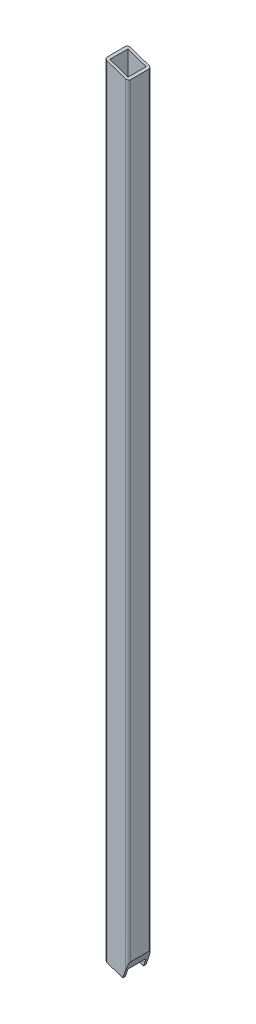
ISO-10303-21;
HEADER;
FILE_DESCRIPTION(('STEP AP214'),'2;1');
FILE_NAME('part.step','',(''),(''),'','','');
FILE_SCHEMA(('AUTOMOTIVE_DESIGN { 1 0 10303 214 1 1 1 1 }'));
ENDSEC;
DATA;
#1=APPLICATION_CONTEXT('core data for automotive mechanical design processes');
#2=APPLICATION_PROTOCOL_DEFINITION('international standard','automotive_design',2000,#1);
#3=PRODUCT_CONTEXT('',#1,'mechanical');
#4=PRODUCT('Part','Part','',(#3));
#5=PRODUCT_RELATED_PRODUCT_CATEGORY('part','',(#4));
#6=PRODUCT_DEFINITION_FORMATION('','',#4);
#7=PRODUCT_DEFINITION_CONTEXT('part definition',#1,'design');
#8=PRODUCT_DEFINITION('design','',#6,#7);
#9=PRODUCT_DEFINITION_SHAPE('','',#8);
#10=(LENGTH_UNIT() NAMED_UNIT(*) SI_UNIT(.MILLI.,.METRE.));
#11=(NAMED_UNIT(*) PLANE_ANGLE_UNIT() SI_UNIT($,.RADIAN.));
#12=(NAMED_UNIT(*) SI_UNIT($,.STERADIAN.) SOLID_ANGLE_UNIT());
#13=UNCERTAINTY_MEASURE_WITH_UNIT(LENGTH_MEASURE(1.E-05),#10,'distance_accuracy_value','');
#14=(GEOMETRIC_REPRESENTATION_CONTEXT(3) GLOBAL_UNCERTAINTY_ASSIGNED_CONTEXT((#13)) GLOBAL_UNIT_ASSIGNED_CONTEXT((#10,
#11,#12)) REPRESENTATION_CONTEXT('',''));
#15=CARTESIAN_POINT('',(0.,0.,0.));
#16=DIRECTION('',(0.,0.,1.));
#17=DIRECTION('',(1.,0.,0.));
#18=AXIS2_PLACEMENT_3D('',#15,#16,#17);
#19=CARTESIAN_POINT('',(25.6,870.,2.80000000000002));
#20=DIRECTION('',(-1.,0.,0.));
#21=DIRECTION('',(0.,0.,1.));
#22=AXIS2_PLACEMENT_3D('',#19,#20,#21);
#23=PLANE('',#22);
#24=DIRECTION('',(0.,0.,1.));
#25=VECTOR('',#24,1.);
#26=CARTESIAN_POINT('',(25.6,22.1138640695995,2.80000000000312));
#27=LINE('',#26,#25);
#28=CARTESIAN_POINT('',(25.6,22.1138640695993,2.80000000000002));
#29=VERTEX_POINT('',#28);
#30=CARTESIAN_POINT('',(25.6,22.1138640695995,22.8));
#31=VERTEX_POINT('',#30);
#32=EDGE_CURVE('E180',#29,#31,#27,.T.);
#33=ORIENTED_EDGE('',*,*,#32,.F.);
#34=DIRECTION('',(0.,-1.,0.));
#35=VECTOR('',#34,1.);
#36=CARTESIAN_POINT('',(25.6,870.,2.80000000000002));
#37=LINE('',#36,#35);
#38=CARTESIAN_POINT('',(25.6,861.185213099785,2.80000000000002));
#39=VERTEX_POINT('',#38);
#40=EDGE_CURVE('E220',#39,#29,#37,.T.);
#41=ORIENTED_EDGE('',*,*,#40,.F.);
#42=DIRECTION('',(0.,0.,1.));
#43=VECTOR('',#42,1.);
#44=CARTESIAN_POINT('',(25.6000000000001,861.185213099785,-1094.14120190298));
#45=LINE('',#44,#43);
#46=CARTESIAN_POINT('',(25.6,861.185213099785,22.8));
#47=VERTEX_POINT('',#46);
#48=EDGE_CURVE('E188',#39,#47,#45,.T.);
#49=ORIENTED_EDGE('',*,*,#48,.T.);
#50=DIRECTION('',(0.,-1.,0.));
#51=VECTOR('',#50,1.);
#52=CARTESIAN_POINT('',(25.6,870.,22.8));
#53=LINE('',#52,#51);
#54=EDGE_CURVE('E190',#47,#31,#53,.T.);
#55=ORIENTED_EDGE('',*,*,#54,.T.);
#56=EDGE_LOOP('',(#33,#41,#49,#55));
#57=FACE_BOUND('',#56,.T.);
#58=ADVANCED_FACE('F38',(#57),#23,.F.);
#59=CARTESIAN_POINT('',(22.8,1040.5,2.8));
#60=DIRECTION('',(1.,0.,0.));
#61=DIRECTION('',(0.,0.,-1.));
#62=AXIS2_PLACEMENT_3D('',#59,#60,#61);
#63=PLANE('',#62);
#64=DIRECTION('',(0.,-1.,0.));
#65=VECTOR('',#64,1.);
#66=CARTESIAN_POINT('',(22.8,1040.5,2.8));
#67=LINE('',#66,#65);
#68=CARTESIAN_POINT('',(22.8,862.149330416996,2.8));
#69=VERTEX_POINT('',#68);
#70=CARTESIAN_POINT('',(22.8,13.9820736121069,2.8));
#71=VERTEX_POINT('',#70);
#72=EDGE_CURVE('E171',#69,#71,#67,.T.);
#73=ORIENTED_EDGE('',*,*,#72,.T.);
#74=DIRECTION('',(0.,0.,-1.));
#75=VECTOR('',#74,1.);
#76=CARTESIAN_POINT('',(22.8,13.982073612107,2.8000000000022));
#77=LINE('',#76,#75);
#78=CARTESIAN_POINT('',(22.8,13.982073612107,22.8));
#79=VERTEX_POINT('',#78);
#80=EDGE_CURVE('E12',#79,#71,#77,.T.);
#81=ORIENTED_EDGE('',*,*,#80,.F.);
#82=DIRECTION('',(0.,-1.,0.));
#83=VECTOR('',#82,1.);
#84=CARTESIAN_POINT('',(22.8,1040.5,22.8));
#85=LINE('',#84,#83);
#86=CARTESIAN_POINT('',(22.8,862.149330416996,22.8));
#87=VERTEX_POINT('',#86);
#88=EDGE_CURVE('E193',#87,#79,#85,.T.);
#89=ORIENTED_EDGE('',*,*,#88,.F.);
#90=DIRECTION('',(0.,0.,-1.));
#91=VECTOR('',#90,1.);
#92=CARTESIAN_POINT('',(22.8,862.149330416996,2.80000000000001));
#93=LINE('',#92,#91);
#94=EDGE_CURVE('E192',#87,#69,#93,.T.);
#95=ORIENTED_EDGE('',*,*,#94,.T.);
#96=EDGE_LOOP('',(#73,#81,#89,#95));
#97=FACE_BOUND('',#96,.T.);
#98=ADVANCED_FACE('F288',(#97),#63,.F.);
#99=CARTESIAN_POINT('',(-350.658923348841,132.997777714205,-118.26127627002));
#100=DIRECTION('',(-0.325568118212889,-0.945518470338344,-0.000471860526607836));
#101=DIRECTION('',(-0.292327412285095,0.100181775938393,0.951056410417663));
#102=AXIS2_PLACEMENT_3D('',#99,#100,#101);
#103=PLANE('',#102);
#104=DIRECTION('',(-0.945518575599321,0.325568154457146,0.));
#105=VECTOR('',#104,1.);
#106=CARTESIAN_POINT('',(-261.554850767002,102.257766836075,0.));
#107=LINE('',#106,#105);
#108=CARTESIAN_POINT('',(19.833886501648,5.36785452577174,0.));
#109=VERTEX_POINT('',#108);
#110=CARTESIAN_POINT('',(2.80000000000002,11.2330920099309,0.));
#111=VERTEX_POINT('',#110);
#112=EDGE_CURVE('E176',#109,#111,#107,.T.);
#113=ORIENTED_EDGE('',*,*,#112,.F.);
#114=DIRECTION('',(-0.000153622760809861,-0.000446152892999452,0.999999888673816));
#115=VECTOR('',#114,1.);
#116=CARTESIAN_POINT('',(19.8520541274279,5.42061714218314,-118.26127627002));
#117=LINE('',#116,#115);
#118=CARTESIAN_POINT('',(19.8334563578698,5.36660529753204,2.8));
#119=VERTEX_POINT('',#118);
#120=EDGE_CURVE('E61',#109,#119,#117,.T.);
#121=ORIENTED_EDGE('',*,*,#120,.T.);
#122=DIRECTION('',(0.945518575599321,-0.325568154457146,0.));
#123=VECTOR('',#122,1.);
#124=CARTESIAN_POINT('',(-314.040421682291,120.328600862861,2.79999999999995));
#125=LINE('',#124,#123);
#126=CARTESIAN_POINT('',(2.8,11.2316946713109,2.8));
#127=VERTEX_POINT('',#126);
#128=EDGE_CURVE('E172',#127,#119,#125,.T.);
#129=ORIENTED_EDGE('',*,*,#128,.F.);
#130=DIRECTION('',(0.,-0.000499049444989014,0.999999875474818));
#131=VECTOR('',#130,1.);
#132=CARTESIAN_POINT('',(2.8,11.2319510109411,2.28634428744401));
#133=LINE('',#132,#131);
#134=CARTESIAN_POINT('',(2.80000000000002,11.2217136811683,22.8));
#135=VERTEX_POINT('',#134);
#136=EDGE_CURVE('E169',#127,#135,#133,.T.);
#137=ORIENTED_EDGE('',*,*,#136,.T.);
#138=DIRECTION('',(0.945518575599319,-0.325568154457149,0.));
#139=VECTOR('',#138,1.);
#140=CARTESIAN_POINT('',(-314.043494137852,120.31967780401,22.7999999999999));
#141=LINE('',#140,#139);
#142=CARTESIAN_POINT('',(19.8303839023116,5.35768223867875,22.8));
#143=VERTEX_POINT('',#142);
#144=EDGE_CURVE('E156',#135,#143,#141,.T.);
#145=ORIENTED_EDGE('',*,*,#144,.T.);
#146=DIRECTION('',(-0.000153622760809861,-0.000446152892999452,0.999999888673816));
#147=VECTOR('',#146,1.);
#148=CARTESIAN_POINT('',(19.852054127428,5.42061714218309,-118.26127627002));
#149=LINE('',#148,#147);
#150=CARTESIAN_POINT('',(19.8299537585333,5.35643301043922,25.6));
#151=VERTEX_POINT('',#150);
#152=EDGE_CURVE('E143',#143,#151,#149,.T.);
#153=ORIENTED_EDGE('',*,*,#152,.T.);
#154=DIRECTION('',(-0.945518575599319,0.325568154457149,0.));
#155=VECTOR('',#154,1.);
#156=CARTESIAN_POINT('',(-261.558783510119,102.246345320745,25.6));
#157=LINE('',#156,#155);
#158=CARTESIAN_POINT('',(2.79999999999999,11.2203163425484,25.6));
#159=VERTEX_POINT('',#158);
#160=EDGE_CURVE('E42',#151,#159,#157,.T.);
#161=ORIENTED_EDGE('',*,*,#160,.T.);
#162=CARTESIAN_POINT('',(2.8,11.2217136811682,22.8));
#163=DIRECTION('',(-0.325568118212889,-0.945518470338344,-0.000471860526607836));
#164=DIRECTION('',(0.94551747726141,-0.325568460157059,0.00137038103480926));
#165=AXIS2_PLACEMENT_3D('',#162,#163,#164);
#166=ELLIPSE('',#165,2.96133823699716,2.8);
#167=CARTESIAN_POINT('',(0.,12.1858309983792,22.8));
#168=VERTEX_POINT('',#167);
#169=EDGE_CURVE('E161',#159,#168,#166,.T.);
#170=ORIENTED_EDGE('',*,*,#169,.T.);
#171=DIRECTION('',(0.,0.000499049444989126,-0.999999875474818));
#172=VECTOR('',#171,1.);
#173=CARTESIAN_POINT('',(0.,12.1960256249539,2.37191334937112));
#174=LINE('',#173,#172);
#175=CARTESIAN_POINT('',(0.,12.1958119885219,2.80000000000002));
#176=VERTEX_POINT('',#175);
#177=EDGE_CURVE('E162',#168,#176,#174,.T.);
#178=ORIENTED_EDGE('',*,*,#177,.T.);
#179=CARTESIAN_POINT('',(2.8,11.2316946713109,2.8));
#180=DIRECTION('',(-0.325568118212889,-0.945518470338344,-0.000471860526607836));
#181=DIRECTION('',(0.94551747726141,-0.325568460157059,0.00137038103480926));
#182=AXIS2_PLACEMENT_3D('',#179,#180,#181);
#183=ELLIPSE('',#182,2.96133823699716,2.8);
#184=EDGE_CURVE('E165',#176,#111,#183,.T.);
#185=ORIENTED_EDGE('',*,*,#184,.T.);
#186=EDGE_LOOP('',(#113,#121,#129,#137,#145,#153,#161,#170,#178,#185));
#187=FACE_BOUND('',#186,.T.);
#188=ADVANCED_FACE('F153',(#187),#103,.T.);
#189=CARTESIAN_POINT('',(2.8,1040.5,2.8));
#190=DIRECTION('',(0.,0.,-1.));
#191=DIRECTION('',(-1.,0.,0.));
#192=AXIS2_PLACEMENT_3D('',#189,#190,#191);
#193=PLANE('',#192);
#194=DIRECTION('',(-0.325568154457149,-0.945518575599319,0.));
#195=VECTOR('',#194,1.);
#196=CARTESIAN_POINT('',(336.673878040164,925.538004434668,2.80000000000005));
#197=LINE('',#196,#195);
#198=EDGE_CURVE('E307',#71,#119,#197,.T.);
#199=ORIENTED_EDGE('',*,*,#198,.F.);
#200=ORIENTED_EDGE('',*,*,#72,.F.);
#201=DIRECTION('',(-0.945518575599319,0.32556815445715,0.));
#202=VECTOR('',#201,1.);
#203=CARTESIAN_POINT('',(-49.9819257164619,887.21015718957,2.79999999999999));
#204=LINE('',#203,#202);
#205=CARTESIAN_POINT('',(2.8,869.035882682789,2.8));
#206=VERTEX_POINT('',#205);
#207=EDGE_CURVE('E174',#69,#206,#204,.T.);
#208=ORIENTED_EDGE('',*,*,#207,.T.);
#209=DIRECTION('',(0.,-1.,0.));
#210=VECTOR('',#209,1.);
#211=CARTESIAN_POINT('',(2.8,1040.5,2.8));
#212=LINE('',#211,#210);
#213=EDGE_CURVE('E175',#206,#127,#212,.T.);
#214=ORIENTED_EDGE('',*,*,#213,.T.);
#215=ORIENTED_EDGE('',*,*,#128,.T.);
#216=EDGE_LOOP('',(#199,#200,#208,#214,#215));
#217=FACE_BOUND('',#216,.T.);
#218=ADVANCED_FACE('F305',(#217),#193,.F.);
#219=CARTESIAN_POINT('',(22.8,870.,2.8));
#220=DIRECTION('',(0.,-1.,0.));
#221=DIRECTION('',(0.,0.,-1.));
#222=AXIS2_PLACEMENT_3D('',#219,#220,#221);
#223=CYLINDRICAL_SURFACE('',#222,2.8);
#224=CARTESIAN_POINT('',(22.8,13.9820736121068,2.8));
#225=DIRECTION('',(0.945518575599319,-0.325568154457149,0.));
#226=DIRECTION('',(-0.325568154457149,-0.945518575599319,0.));
#227=AXIS2_PLACEMENT_3D('',#224,#225,#226);
#228=ELLIPSE('',#227,8.60034976292047,2.8);
#229=CARTESIAN_POINT('',(22.8,13.9820736121067,0.));
#230=VERTEX_POINT('',#229);
#231=EDGE_CURVE('E268',#230,#29,#228,.T.);
#232=ORIENTED_EDGE('',*,*,#231,.F.);
#233=DIRECTION('',(0.,-1.,0.));
#234=VECTOR('',#233,1.);
#235=CARTESIAN_POINT('',(22.8,870.,0.));
#236=LINE('',#235,#234);
#237=CARTESIAN_POINT('',(22.8,862.149330416996,0.));
#238=VERTEX_POINT('',#237);
#239=EDGE_CURVE('E179',#238,#230,#236,.T.);
#240=ORIENTED_EDGE('',*,*,#239,.F.);
#241=CARTESIAN_POINT('',(22.8,862.149330416996,2.8));
#242=DIRECTION('',(-0.32556815445715,-0.945518575599319,0.));
#243=DIRECTION('',(0.945518575599319,-0.32556815445715,0.));
#244=AXIS2_PLACEMENT_3D('',#241,#242,#243);
#245=ELLIPSE('',#244,2.96133790732267,2.8);
#246=EDGE_CURVE('E208',#238,#39,#245,.T.);
#247=ORIENTED_EDGE('',*,*,#246,.T.);
#248=ORIENTED_EDGE('',*,*,#40,.T.);
#249=EDGE_LOOP('',(#232,#240,#247,#248));
#250=FACE_BOUND('',#249,.T.);
#251=ADVANCED_FACE('F263',(#250),#223,.T.);
#252=CARTESIAN_POINT('',(2.80000000000002,870.,0.));
#253=DIRECTION('',(0.,0.,1.));
#254=DIRECTION('',(1.,0.,0.));
#255=AXIS2_PLACEMENT_3D('',#252,#253,#254);
#256=PLANE('',#255);
#257=DIRECTION('',(0.325568154457149,0.945518575599319,0.));
#258=VECTOR('',#257,1.);
#259=CARTESIAN_POINT('',(284.188737268653,773.110087689695,0.));
#260=LINE('',#259,#258);
#261=EDGE_CURVE('E238',#109,#230,#260,.T.);
#262=ORIENTED_EDGE('',*,*,#261,.F.);
#263=ORIENTED_EDGE('',*,*,#112,.T.);
#264=DIRECTION('',(0.,-1.,0.));
#265=VECTOR('',#264,1.);
#266=CARTESIAN_POINT('',(2.80000000000002,870.,0.));
#267=LINE('',#266,#265);
#268=CARTESIAN_POINT('',(2.80000000000002,869.035882682789,0.));
#269=VERTEX_POINT('',#268);
#270=EDGE_CURVE('E209',#269,#111,#267,.T.);
#271=ORIENTED_EDGE('',*,*,#270,.F.);
#272=DIRECTION('',(0.945518575599319,-0.32556815445715,0.));
#273=VECTOR('',#272,1.);
#274=CARTESIAN_POINT('',(2.50321505504944,869.138073934544,0.));
#275=LINE('',#274,#273);
#276=EDGE_CURVE('E178',#269,#238,#275,.T.);
#277=ORIENTED_EDGE('',*,*,#276,.T.);
#278=ORIENTED_EDGE('',*,*,#239,.T.);
#279=EDGE_LOOP('',(#262,#263,#271,#277,#278));
#280=FACE_BOUND('',#279,.T.);
#281=ADVANCED_FACE('F254',(#280),#256,.F.);
#282=CARTESIAN_POINT('',(2.80000000000002,870.,25.6));
#283=DIRECTION('',(0.,0.,-1.));
#284=DIRECTION('',(-1.,0.,0.));
#285=AXIS2_PLACEMENT_3D('',#282,#283,#284);
#286=PLANE('',#285);
#287=DIRECTION('',(-0.325568154457149,-0.945518575599319,0.));
#288=VECTOR('',#287,1.);
#289=CARTESIAN_POINT('',(284.188737268653,773.110087689695,25.6));
#290=LINE('',#289,#288);
#291=CARTESIAN_POINT('',(22.7999999999999,13.9820736121067,25.6));
#292=VERTEX_POINT('',#291);
#293=EDGE_CURVE('E140',#292,#151,#290,.T.);
#294=ORIENTED_EDGE('',*,*,#293,.F.);
#295=DIRECTION('',(0.,-1.,0.));
#296=VECTOR('',#295,1.);
#297=CARTESIAN_POINT('',(22.8,870.,25.6));
#298=LINE('',#297,#296);
#299=CARTESIAN_POINT('',(22.8,862.149330416996,25.6));
#300=VERTEX_POINT('',#299);
#301=EDGE_CURVE('E186',#300,#292,#298,.T.);
#302=ORIENTED_EDGE('',*,*,#301,.F.);
#303=DIRECTION('',(-0.945518575599319,0.32556815445715,0.));
#304=VECTOR('',#303,1.);
#305=CARTESIAN_POINT('',(2.50321505504944,869.138073934544,25.6));
#306=LINE('',#305,#304);
#307=CARTESIAN_POINT('',(2.80000000000002,869.035882682789,25.6));
#308=VERTEX_POINT('',#307);
#309=EDGE_CURVE('E202',#300,#308,#306,.T.);
#310=ORIENTED_EDGE('',*,*,#309,.T.);
#311=DIRECTION('',(0.,-1.,0.));
#312=VECTOR('',#311,1.);
#313=CARTESIAN_POINT('',(2.80000000000002,870.,25.6));
#314=LINE('',#313,#312);
#315=EDGE_CURVE('E160',#308,#159,#314,.T.);
#316=ORIENTED_EDGE('',*,*,#315,.T.);
#317=ORIENTED_EDGE('',*,*,#160,.F.);
#318=EDGE_LOOP('',(#294,#302,#310,#316,#317));
#319=FACE_BOUND('',#318,.T.);
#320=ADVANCED_FACE('F40',(#319),#286,.F.);
#321=CARTESIAN_POINT('',(2.8,1040.5,22.8));
#322=DIRECTION('',(0.,0.,1.));
#323=DIRECTION('',(1.,0.,0.));
#324=AXIS2_PLACEMENT_3D('',#321,#322,#323);
#325=PLANE('',#324);
#326=DIRECTION('',(0.325568154457149,0.945518575599319,0.));
#327=VECTOR('',#326,1.);
#328=CARTESIAN_POINT('',(336.673878040164,925.538004434668,22.8000000000001));
#329=LINE('',#328,#327);
#330=EDGE_CURVE('E47',#143,#79,#329,.T.);
#331=ORIENTED_EDGE('',*,*,#330,.F.);
#332=ORIENTED_EDGE('',*,*,#144,.F.);
#333=DIRECTION('',(0.,-1.,0.));
#334=VECTOR('',#333,1.);
#335=CARTESIAN_POINT('',(2.8,1040.5,22.8));
#336=LINE('',#335,#334);
#337=CARTESIAN_POINT('',(2.8,869.035882682789,22.8));
#338=VERTEX_POINT('',#337);
#339=EDGE_CURVE('E223',#338,#135,#336,.T.);
#340=ORIENTED_EDGE('',*,*,#339,.F.);
#341=DIRECTION('',(0.945518575599319,-0.32556815445715,0.));
#342=VECTOR('',#341,1.);
#343=CARTESIAN_POINT('',(-49.9819257164619,887.21015718957,22.8));
#344=LINE('',#343,#342);
#345=EDGE_CURVE('E195',#338,#87,#344,.T.);
#346=ORIENTED_EDGE('',*,*,#345,.T.);
#347=ORIENTED_EDGE('',*,*,#88,.T.);
#348=EDGE_LOOP('',(#331,#332,#340,#346,#347));
#349=FACE_BOUND('',#348,.T.);
#350=ADVANCED_FACE('F298',(#349),#325,.F.);
#351=CARTESIAN_POINT('',(22.8,870.,22.8));
#352=DIRECTION('',(0.,-1.,0.));
#353=DIRECTION('',(0.,0.,-1.));
#354=AXIS2_PLACEMENT_3D('',#351,#352,#353);
#355=CYLINDRICAL_SURFACE('',#354,2.8);
#356=CARTESIAN_POINT('',(22.8,13.9820736121069,22.8));
#357=DIRECTION('',(0.945518575599319,-0.325568154457149,0.));
#358=DIRECTION('',(-0.325568154457149,-0.945518575599319,0.));
#359=AXIS2_PLACEMENT_3D('',#356,#357,#358);
#360=ELLIPSE('',#359,8.60034976292047,2.8);
#361=EDGE_CURVE('E146',#31,#292,#360,.T.);
#362=ORIENTED_EDGE('',*,*,#361,.F.);
#363=ORIENTED_EDGE('',*,*,#54,.F.);
#364=CARTESIAN_POINT('',(22.8,862.149330416996,22.8));
#365=DIRECTION('',(-0.32556815445715,-0.945518575599319,0.));
#366=DIRECTION('',(0.945518575599319,-0.32556815445715,0.));
#367=AXIS2_PLACEMENT_3D('',#364,#365,#366);
#368=ELLIPSE('',#367,2.96133790732267,2.8);
#369=EDGE_CURVE('E189',#47,#300,#368,.T.);
#370=ORIENTED_EDGE('',*,*,#369,.T.);
#371=ORIENTED_EDGE('',*,*,#301,.T.);
#372=EDGE_LOOP('',(#362,#363,#370,#371));
#373=FACE_BOUND('',#372,.T.);
#374=ADVANCED_FACE('F270',(#373),#355,.T.);
#375=CARTESIAN_POINT('',(2.8,870.,2.8));
#376=DIRECTION('',(0.,-1.,0.));
#377=DIRECTION('',(0.,0.,-1.));
#378=AXIS2_PLACEMENT_3D('',#375,#376,#377);
#379=CYLINDRICAL_SURFACE('',#378,2.8);
#380=ORIENTED_EDGE('',*,*,#270,.T.);
#381=ORIENTED_EDGE('',*,*,#184,.F.);
#382=DIRECTION('',(0.,-1.,0.));
#383=VECTOR('',#382,1.);
#384=CARTESIAN_POINT('',(0.,870.,2.80000000000002));
#385=LINE('',#384,#383);
#386=CARTESIAN_POINT('',(0.,870.,2.80000000000002));
#387=VERTEX_POINT('',#386);
#388=EDGE_CURVE('E213',#387,#176,#385,.T.);
#389=ORIENTED_EDGE('',*,*,#388,.F.);
#390=CARTESIAN_POINT('',(2.8,869.035882682789,2.8));
#391=DIRECTION('',(-0.32556815445715,-0.945518575599319,0.));
#392=DIRECTION('',(0.945518575599319,-0.32556815445715,0.));
#393=AXIS2_PLACEMENT_3D('',#390,#391,#392);
#394=ELLIPSE('',#393,2.96133790732267,2.8);
#395=EDGE_CURVE('E212',#387,#269,#394,.T.);
#396=ORIENTED_EDGE('',*,*,#395,.T.);
#397=EDGE_LOOP('',(#380,#381,#389,#396));
#398=FACE_BOUND('',#397,.T.);
#399=ADVANCED_FACE('F250',(#398),#379,.T.);
#400=CARTESIAN_POINT('',(0.,870.,2.80000000000002));
#401=DIRECTION('',(1.,0.,0.));
#402=DIRECTION('',(0.,0.,-1.));
#403=AXIS2_PLACEMENT_3D('',#400,#401,#402);
#404=PLANE('',#403);
#405=ORIENTED_EDGE('',*,*,#177,.F.);
#406=DIRECTION('',(0.,-1.,0.));
#407=VECTOR('',#406,1.);
#408=CARTESIAN_POINT('',(0.,870.,22.8));
#409=LINE('',#408,#407);
#410=CARTESIAN_POINT('',(0.,870.,22.7999999999999));
#411=VERTEX_POINT('',#410);
#412=EDGE_CURVE('E217',#411,#168,#409,.T.);
#413=ORIENTED_EDGE('',*,*,#412,.F.);
#414=DIRECTION('',(0.,0.,1.));
#415=VECTOR('',#414,1.);
#416=CARTESIAN_POINT('',(0.,870.,2.80000000000002));
#417=LINE('',#416,#415);
#418=EDGE_CURVE('E182',#387,#411,#417,.T.);
#419=ORIENTED_EDGE('',*,*,#418,.F.);
#420=ORIENTED_EDGE('',*,*,#388,.T.);
#421=EDGE_LOOP('',(#405,#413,#419,#420));
#422=FACE_BOUND('',#421,.T.);
#423=ADVANCED_FACE('F277',(#422),#404,.F.);
#424=CARTESIAN_POINT('',(2.8,870.,22.8));
#425=DIRECTION('',(0.,-1.,0.));
#426=DIRECTION('',(0.,0.,-1.));
#427=AXIS2_PLACEMENT_3D('',#424,#425,#426);
#428=CYLINDRICAL_SURFACE('',#427,2.8);
#429=ORIENTED_EDGE('',*,*,#169,.F.);
#430=ORIENTED_EDGE('',*,*,#315,.F.);
#431=CARTESIAN_POINT('',(2.8,869.035882682789,22.8));
#432=DIRECTION('',(-0.32556815445715,-0.945518575599319,0.));
#433=DIRECTION('',(0.945518575599319,-0.32556815445715,0.));
#434=AXIS2_PLACEMENT_3D('',#431,#432,#433);
#435=ELLIPSE('',#434,2.96133790732267,2.8);
#436=EDGE_CURVE('E216',#308,#411,#435,.T.);
#437=ORIENTED_EDGE('',*,*,#436,.T.);
#438=ORIENTED_EDGE('',*,*,#412,.T.);
#439=EDGE_LOOP('',(#429,#430,#437,#438));
#440=FACE_BOUND('',#439,.T.);
#441=ADVANCED_FACE('F275',(#440),#428,.T.);
#442=CARTESIAN_POINT('',(2.8,1040.5,2.8));
#443=DIRECTION('',(-1.,0.,0.));
#444=DIRECTION('',(0.,0.,1.));
#445=AXIS2_PLACEMENT_3D('',#442,#443,#444);
#446=PLANE('',#445);
#447=ORIENTED_EDGE('',*,*,#136,.F.);
#448=ORIENTED_EDGE('',*,*,#213,.F.);
#449=DIRECTION('',(0.,0.,1.));
#450=VECTOR('',#449,1.);
#451=CARTESIAN_POINT('',(2.8,869.035882682789,2.8));
#452=LINE('',#451,#450);
#453=EDGE_CURVE('E228',#206,#338,#452,.T.);
#454=ORIENTED_EDGE('',*,*,#453,.T.);
#455=ORIENTED_EDGE('',*,*,#339,.T.);
#456=EDGE_LOOP('',(#447,#448,#454,#455));
#457=FACE_BOUND('',#456,.T.);
#458=ADVANCED_FACE('F284',(#457),#446,.F.);
#459=CARTESIAN_POINT('',(1.93758412422685E-13,870.,-1094.14120190298));
#460=DIRECTION('',(-0.32556815445715,-0.945518575599319,0.));
#461=DIRECTION('',(0.945518575599319,-0.32556815445715,0.));
#462=AXIS2_PLACEMENT_3D('',#459,#460,#461);
#463=PLANE('',#462);
#464=ORIENTED_EDGE('',*,*,#94,.F.);
#465=ORIENTED_EDGE('',*,*,#345,.F.);
#466=ORIENTED_EDGE('',*,*,#453,.F.);
#467=ORIENTED_EDGE('',*,*,#207,.F.);
#468=EDGE_LOOP('',(#464,#465,#466,#467));
#469=FACE_BOUND('',#468,.T.);
#470=ORIENTED_EDGE('',*,*,#246,.F.);
#471=ORIENTED_EDGE('',*,*,#276,.F.);
#472=ORIENTED_EDGE('',*,*,#395,.F.);
#473=ORIENTED_EDGE('',*,*,#418,.T.);
#474=ORIENTED_EDGE('',*,*,#436,.F.);
#475=ORIENTED_EDGE('',*,*,#309,.F.);
#476=ORIENTED_EDGE('',*,*,#369,.F.);
#477=ORIENTED_EDGE('',*,*,#48,.F.);
#478=EDGE_LOOP('',(#470,#471,#472,#473,#474,#475,#476,#477));
#479=FACE_BOUND('',#478,.T.);
#480=ADVANCED_FACE('F258',(#469,#479),#463,.F.);
#481=CARTESIAN_POINT('',(292.599537086842,797.536824011635,7.46419789654112));
#482=DIRECTION('',(0.945518575599319,-0.325568154457149,0.));
#483=DIRECTION('',(0.,0.,-1.));
#484=AXIS2_PLACEMENT_3D('',#481,#482,#483);
#485=PLANE('',#484);
#486=ORIENTED_EDGE('',*,*,#32,.T.);
#487=ORIENTED_EDGE('',*,*,#361,.T.);
#488=ORIENTED_EDGE('',*,*,#293,.T.);
#489=ORIENTED_EDGE('',*,*,#152,.F.);
#490=ORIENTED_EDGE('',*,*,#330,.T.);
#491=ORIENTED_EDGE('',*,*,#80,.T.);
#492=ORIENTED_EDGE('',*,*,#198,.T.);
#493=ORIENTED_EDGE('',*,*,#120,.F.);
#494=ORIENTED_EDGE('',*,*,#261,.T.);
#495=ORIENTED_EDGE('',*,*,#231,.T.);
#496=EDGE_LOOP('',(#486,#487,#488,#489,#490,#491,#492,#493,#494,#495));
#497=FACE_BOUND('',#496,.T.);
#498=ADVANCED_FACE('F142',(#497),#485,.T.);
#499=CLOSED_SHELL('',(#58,#98,#188,#218,#251,#281,#320,#350,#374,#399,#423,#441,#458,#480,#498));
#500=MANIFOLD_SOLID_BREP('B2',#499);
#501=ADVANCED_BREP_SHAPE_REPRESENTATION('',(#18,#500),#14);
#502=SHAPE_DEFINITION_REPRESENTATION(#9,#501);
ENDSEC;
END-ISO-10303-21;
